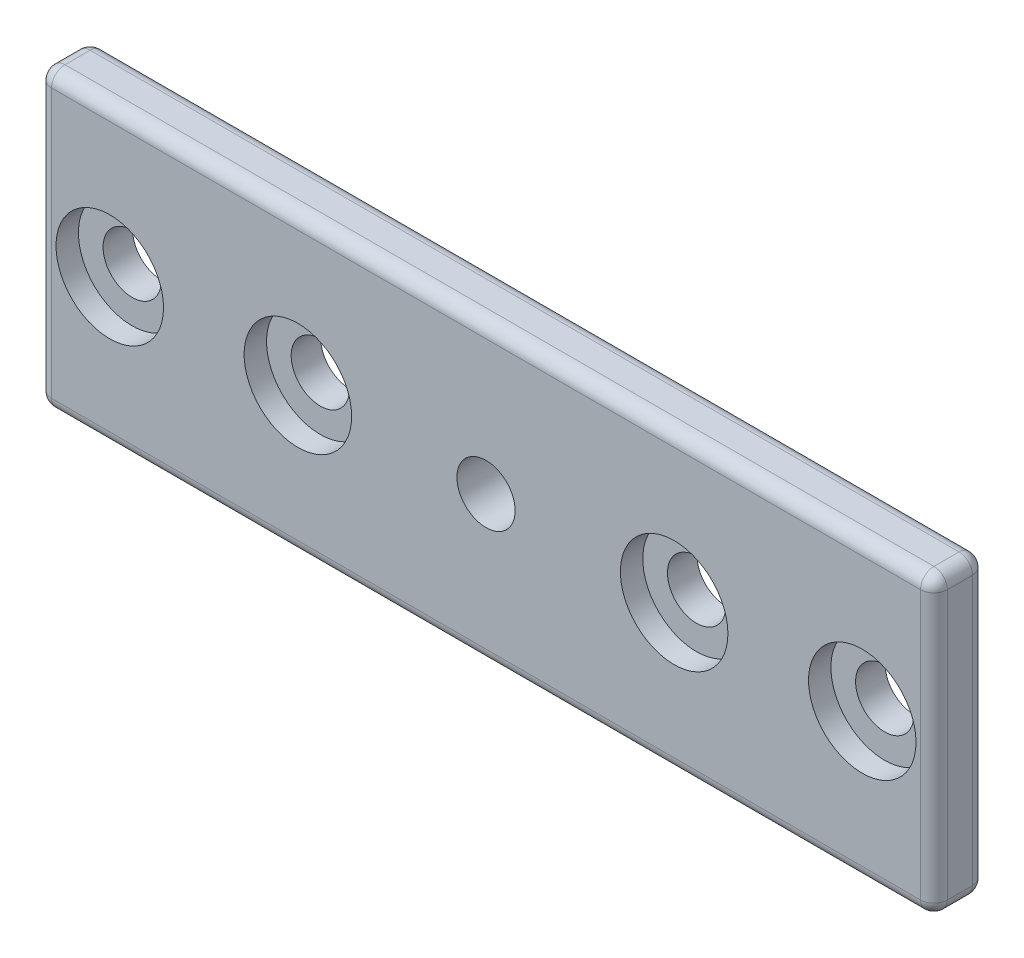
ISO-10303-21;
HEADER;
FILE_DESCRIPTION(('STEP AP214'),'2;1');
FILE_NAME('part.step','',(''),(''),'','','');
FILE_SCHEMA(('AUTOMOTIVE_DESIGN { 1 0 10303 214 1 1 1 1 }'));
ENDSEC;
DATA;
#1=APPLICATION_CONTEXT('core data for automotive mechanical design processes');
#2=APPLICATION_PROTOCOL_DEFINITION('international standard','automotive_design',2000,#1);
#3=PRODUCT_CONTEXT('',#1,'mechanical');
#4=PRODUCT('Part','Part','',(#3));
#5=PRODUCT_RELATED_PRODUCT_CATEGORY('part','',(#4));
#6=PRODUCT_DEFINITION_FORMATION('','',#4);
#7=PRODUCT_DEFINITION_CONTEXT('part definition',#1,'design');
#8=PRODUCT_DEFINITION('design','',#6,#7);
#9=PRODUCT_DEFINITION_SHAPE('','',#8);
#10=(LENGTH_UNIT() NAMED_UNIT(*) SI_UNIT(.MILLI.,.METRE.));
#11=(NAMED_UNIT(*) PLANE_ANGLE_UNIT() SI_UNIT($,.RADIAN.));
#12=(NAMED_UNIT(*) SI_UNIT($,.STERADIAN.) SOLID_ANGLE_UNIT());
#13=UNCERTAINTY_MEASURE_WITH_UNIT(LENGTH_MEASURE(1.E-05),#10,'distance_accuracy_value','');
#14=(GEOMETRIC_REPRESENTATION_CONTEXT(3) GLOBAL_UNCERTAINTY_ASSIGNED_CONTEXT((#13)) GLOBAL_UNIT_ASSIGNED_CONTEXT((#10,
#11,#12)) REPRESENTATION_CONTEXT('',''));
#15=CARTESIAN_POINT('',(0.,0.,0.));
#16=DIRECTION('',(0.,0.,1.));
#17=DIRECTION('',(1.,0.,0.));
#18=AXIS2_PLACEMENT_3D('',#15,#16,#17);
#19=CARTESIAN_POINT('',(92.,16.5,0.));
#20=DIRECTION('',(0.,0.,1.));
#21=DIRECTION('',(1.,0.,0.));
#22=AXIS2_PLACEMENT_3D('',#19,#20,#21);
#23=CYLINDRICAL_SURFACE('',#22,3.25000000000001);
#24=CARTESIAN_POINT('',(92.,16.5,0.));
#25=DIRECTION('',(0.,0.,1.));
#26=DIRECTION('',(1.,0.,0.));
#27=AXIS2_PLACEMENT_3D('',#24,#25,#26);
#28=CIRCLE('',#27,3.25000000000001);
#29=CARTESIAN_POINT('',(95.25,16.5,0.));
#30=VERTEX_POINT('',#29);
#31=EDGE_CURVE('E354',#30,#30,#28,.T.);
#32=ORIENTED_EDGE('',*,*,#31,.F.);
#33=EDGE_LOOP('',(#32));
#34=FACE_BOUND('',#33,.T.);
#35=CARTESIAN_POINT('',(92.,16.5,3.3));
#36=DIRECTION('',(0.,0.,1.));
#37=DIRECTION('',(1.,0.,0.));
#38=AXIS2_PLACEMENT_3D('',#35,#36,#37);
#39=CIRCLE('',#38,3.25000000000001);
#40=CARTESIAN_POINT('',(95.25,16.5,3.3));
#41=VERTEX_POINT('',#40);
#42=EDGE_CURVE('E183',#41,#41,#39,.F.);
#43=ORIENTED_EDGE('',*,*,#42,.F.);
#44=EDGE_LOOP('',(#43));
#45=FACE_BOUND('',#44,.T.);
#46=ADVANCED_FACE('F45',(#34,#45),#23,.F.);
#47=CARTESIAN_POINT('',(71.,16.5,0.));
#48=DIRECTION('',(0.,0.,1.));
#49=DIRECTION('',(1.,0.,0.));
#50=AXIS2_PLACEMENT_3D('',#47,#48,#49);
#51=CYLINDRICAL_SURFACE('',#50,3.24999999999999);
#52=CARTESIAN_POINT('',(71.,16.5,0.));
#53=DIRECTION('',(0.,0.,1.));
#54=DIRECTION('',(1.,0.,0.));
#55=AXIS2_PLACEMENT_3D('',#52,#53,#54);
#56=CIRCLE('',#55,3.24999999999999);
#57=CARTESIAN_POINT('',(74.25,16.5,0.));
#58=VERTEX_POINT('',#57);
#59=EDGE_CURVE('E350',#58,#58,#56,.T.);
#60=ORIENTED_EDGE('',*,*,#59,.F.);
#61=EDGE_LOOP('',(#60));
#62=FACE_BOUND('',#61,.T.);
#63=CARTESIAN_POINT('',(71.,16.5,3.3));
#64=DIRECTION('',(0.,0.,1.));
#65=DIRECTION('',(1.,0.,0.));
#66=AXIS2_PLACEMENT_3D('',#63,#64,#65);
#67=CIRCLE('',#66,3.24999999999999);
#68=CARTESIAN_POINT('',(74.25,16.5,3.3));
#69=VERTEX_POINT('',#68);
#70=EDGE_CURVE('E366',#69,#69,#67,.F.);
#71=ORIENTED_EDGE('',*,*,#70,.F.);
#72=EDGE_LOOP('',(#71));
#73=FACE_BOUND('',#72,.T.);
#74=ADVANCED_FACE('F378',(#62,#73),#51,.F.);
#75=CARTESIAN_POINT('',(29.,16.5,0.));
#76=DIRECTION('',(0.,0.,1.));
#77=DIRECTION('',(1.,0.,0.));
#78=AXIS2_PLACEMENT_3D('',#75,#76,#77);
#79=CYLINDRICAL_SURFACE('',#78,3.25);
#80=CARTESIAN_POINT('',(29.,16.5,0.));
#81=DIRECTION('',(0.,0.,1.));
#82=DIRECTION('',(1.,0.,0.));
#83=AXIS2_PLACEMENT_3D('',#80,#81,#82);
#84=CIRCLE('',#83,3.25);
#85=CARTESIAN_POINT('',(32.25,16.5,0.));
#86=VERTEX_POINT('',#85);
#87=EDGE_CURVE('E180',#86,#86,#84,.T.);
#88=ORIENTED_EDGE('',*,*,#87,.F.);
#89=EDGE_LOOP('',(#88));
#90=FACE_BOUND('',#89,.T.);
#91=CARTESIAN_POINT('',(29.,16.5,3.3));
#92=DIRECTION('',(0.,0.,1.));
#93=DIRECTION('',(1.,0.,0.));
#94=AXIS2_PLACEMENT_3D('',#91,#92,#93);
#95=CIRCLE('',#94,3.25);
#96=CARTESIAN_POINT('',(32.25,16.5,3.3));
#97=VERTEX_POINT('',#96);
#98=EDGE_CURVE('E362',#97,#97,#95,.F.);
#99=ORIENTED_EDGE('',*,*,#98,.F.);
#100=EDGE_LOOP('',(#99));
#101=FACE_BOUND('',#100,.T.);
#102=ADVANCED_FACE('F385',(#90,#101),#79,.F.);
#103=CARTESIAN_POINT('',(8.,16.5,0.));
#104=DIRECTION('',(0.,0.,1.));
#105=DIRECTION('',(1.,0.,0.));
#106=AXIS2_PLACEMENT_3D('',#103,#104,#105);
#107=CYLINDRICAL_SURFACE('',#106,3.25);
#108=CARTESIAN_POINT('',(8.,16.5,0.));
#109=DIRECTION('',(0.,0.,1.));
#110=DIRECTION('',(1.,0.,0.));
#111=AXIS2_PLACEMENT_3D('',#108,#109,#110);
#112=CIRCLE('',#111,3.25);
#113=CARTESIAN_POINT('',(11.25,16.5,0.));
#114=VERTEX_POINT('',#113);
#115=EDGE_CURVE('E176',#114,#114,#112,.T.);
#116=ORIENTED_EDGE('',*,*,#115,.F.);
#117=EDGE_LOOP('',(#116));
#118=FACE_BOUND('',#117,.T.);
#119=CARTESIAN_POINT('',(8.,16.5,3.3));
#120=DIRECTION('',(0.,0.,1.));
#121=DIRECTION('',(1.,0.,0.));
#122=AXIS2_PLACEMENT_3D('',#119,#120,#121);
#123=CIRCLE('',#122,3.25);
#124=CARTESIAN_POINT('',(11.25,16.5,3.3));
#125=VERTEX_POINT('',#124);
#126=EDGE_CURVE('E358',#125,#125,#123,.F.);
#127=ORIENTED_EDGE('',*,*,#126,.F.);
#128=EDGE_LOOP('',(#127));
#129=FACE_BOUND('',#128,.T.);
#130=ADVANCED_FACE('F412',(#118,#129),#107,.F.);
#131=CARTESIAN_POINT('',(0.,0.,5.8));
#132=DIRECTION('',(1.,0.,0.));
#133=DIRECTION('',(0.,0.,-1.));
#134=AXIS2_PLACEMENT_3D('',#131,#132,#133);
#135=PLANE('',#134);
#136=DIRECTION('',(0.,-1.,0.));
#137=VECTOR('',#136,1.);
#138=CARTESIAN_POINT('',(0.,0.,4.3));
#139=LINE('',#138,#137);
#140=CARTESIAN_POINT('',(0.,1.5,4.3));
#141=VERTEX_POINT('',#140);
#142=CARTESIAN_POINT('',(0.,31.5,4.3));
#143=VERTEX_POINT('',#142);
#144=EDGE_CURVE('E155',#141,#143,#139,.F.);
#145=ORIENTED_EDGE('',*,*,#144,.T.);
#146=DIRECTION('',(0.,0.,-1.));
#147=VECTOR('',#146,1.);
#148=CARTESIAN_POINT('',(0.,31.5,5.8));
#149=LINE('',#148,#147);
#150=CARTESIAN_POINT('',(0.,31.5,1.5));
#151=VERTEX_POINT('',#150);
#152=EDGE_CURVE('E224',#143,#151,#149,.T.);
#153=ORIENTED_EDGE('',*,*,#152,.T.);
#154=DIRECTION('',(0.,-1.,0.));
#155=VECTOR('',#154,1.);
#156=CARTESIAN_POINT('',(0.,0.,1.5));
#157=LINE('',#156,#155);
#158=CARTESIAN_POINT('',(0.,1.5,1.5));
#159=VERTEX_POINT('',#158);
#160=EDGE_CURVE('E219',#151,#159,#157,.T.);
#161=ORIENTED_EDGE('',*,*,#160,.T.);
#162=DIRECTION('',(0.,0.,-1.));
#163=VECTOR('',#162,1.);
#164=CARTESIAN_POINT('',(0.,1.5,5.8));
#165=LINE('',#164,#163);
#166=EDGE_CURVE('E216',#159,#141,#165,.F.);
#167=ORIENTED_EDGE('',*,*,#166,.T.);
#168=EDGE_LOOP('',(#145,#153,#161,#167));
#169=FACE_BOUND('',#168,.T.);
#170=ADVANCED_FACE('F409',(#169),#135,.F.);
#171=CARTESIAN_POINT('',(0.,0.,5.8));
#172=DIRECTION('',(0.,1.,0.));
#173=DIRECTION('',(0.,0.,1.));
#174=AXIS2_PLACEMENT_3D('',#171,#172,#173);
#175=PLANE('',#174);
#176=DIRECTION('',(1.,0.,0.));
#177=VECTOR('',#176,1.);
#178=CARTESIAN_POINT('',(0.,0.,4.3));
#179=LINE('',#178,#177);
#180=CARTESIAN_POINT('',(98.5,0.,4.3));
#181=VERTEX_POINT('',#180);
#182=CARTESIAN_POINT('',(1.5,0.,4.3));
#183=VERTEX_POINT('',#182);
#184=EDGE_CURVE('E55',#181,#183,#179,.F.);
#185=ORIENTED_EDGE('',*,*,#184,.T.);
#186=DIRECTION('',(0.,0.,-1.));
#187=VECTOR('',#186,1.);
#188=CARTESIAN_POINT('',(1.5,0.,5.8));
#189=LINE('',#188,#187);
#190=CARTESIAN_POINT('',(1.5,0.,1.5));
#191=VERTEX_POINT('',#190);
#192=EDGE_CURVE('E11',#183,#191,#189,.T.);
#193=ORIENTED_EDGE('',*,*,#192,.T.);
#194=DIRECTION('',(1.,0.,0.));
#195=VECTOR('',#194,1.);
#196=CARTESIAN_POINT('',(100.,0.,1.5));
#197=LINE('',#196,#195);
#198=CARTESIAN_POINT('',(98.5,0.,1.5));
#199=VERTEX_POINT('',#198);
#200=EDGE_CURVE('E240',#191,#199,#197,.T.);
#201=ORIENTED_EDGE('',*,*,#200,.T.);
#202=DIRECTION('',(0.,0.,-1.));
#203=VECTOR('',#202,1.);
#204=CARTESIAN_POINT('',(98.5,0.,5.8));
#205=LINE('',#204,#203);
#206=EDGE_CURVE('E66',#199,#181,#205,.F.);
#207=ORIENTED_EDGE('',*,*,#206,.T.);
#208=EDGE_LOOP('',(#185,#193,#201,#207));
#209=FACE_BOUND('',#208,.T.);
#210=ADVANCED_FACE('F405',(#209),#175,.F.);
#211=CARTESIAN_POINT('',(100.,0.,5.8));
#212=DIRECTION('',(-1.,0.,0.));
#213=DIRECTION('',(0.,0.,1.));
#214=AXIS2_PLACEMENT_3D('',#211,#212,#213);
#215=PLANE('',#214);
#216=DIRECTION('',(0.,1.,0.));
#217=VECTOR('',#216,1.);
#218=CARTESIAN_POINT('',(100.,33.,1.5));
#219=LINE('',#218,#217);
#220=CARTESIAN_POINT('',(100.,1.5,1.5));
#221=VERTEX_POINT('',#220);
#222=CARTESIAN_POINT('',(100.,31.5,1.5));
#223=VERTEX_POINT('',#222);
#224=EDGE_CURVE('E193',#221,#223,#219,.T.);
#225=ORIENTED_EDGE('',*,*,#224,.T.);
#226=DIRECTION('',(0.,0.,-1.));
#227=VECTOR('',#226,1.);
#228=CARTESIAN_POINT('',(100.,31.5,5.8));
#229=LINE('',#228,#227);
#230=CARTESIAN_POINT('',(100.,31.5,4.3));
#231=VERTEX_POINT('',#230);
#232=EDGE_CURVE('E200',#223,#231,#229,.F.);
#233=ORIENTED_EDGE('',*,*,#232,.T.);
#234=DIRECTION('',(0.,1.,0.));
#235=VECTOR('',#234,1.);
#236=CARTESIAN_POINT('',(100.,0.,4.3));
#237=LINE('',#236,#235);
#238=CARTESIAN_POINT('',(100.,1.5,4.3));
#239=VERTEX_POINT('',#238);
#240=EDGE_CURVE('E196',#231,#239,#237,.F.);
#241=ORIENTED_EDGE('',*,*,#240,.T.);
#242=DIRECTION('',(0.,0.,-1.));
#243=VECTOR('',#242,1.);
#244=CARTESIAN_POINT('',(100.,1.5,5.8));
#245=LINE('',#244,#243);
#246=EDGE_CURVE('E190',#239,#221,#245,.T.);
#247=ORIENTED_EDGE('',*,*,#246,.T.);
#248=EDGE_LOOP('',(#225,#233,#241,#247));
#249=FACE_BOUND('',#248,.T.);
#250=ADVANCED_FACE('F401',(#249),#215,.F.);
#251=CARTESIAN_POINT('',(0.,33.,5.8));
#252=DIRECTION('',(0.,-1.,0.));
#253=DIRECTION('',(0.,0.,-1.));
#254=AXIS2_PLACEMENT_3D('',#251,#252,#253);
#255=PLANE('',#254);
#256=DIRECTION('',(-1.,0.,0.));
#257=VECTOR('',#256,1.);
#258=CARTESIAN_POINT('',(0.,33.,4.3));
#259=LINE('',#258,#257);
#260=CARTESIAN_POINT('',(1.5,33.,4.3));
#261=VERTEX_POINT('',#260);
#262=CARTESIAN_POINT('',(98.5,33.,4.3));
#263=VERTEX_POINT('',#262);
#264=EDGE_CURVE('E233',#261,#263,#259,.F.);
#265=ORIENTED_EDGE('',*,*,#264,.T.);
#266=DIRECTION('',(0.,0.,-1.));
#267=VECTOR('',#266,1.);
#268=CARTESIAN_POINT('',(98.5,33.,5.8));
#269=LINE('',#268,#267);
#270=CARTESIAN_POINT('',(98.5,33.,1.5));
#271=VERTEX_POINT('',#270);
#272=EDGE_CURVE('E236',#263,#271,#269,.T.);
#273=ORIENTED_EDGE('',*,*,#272,.T.);
#274=DIRECTION('',(-1.,0.,0.));
#275=VECTOR('',#274,1.);
#276=CARTESIAN_POINT('',(0.,33.,1.5));
#277=LINE('',#276,#275);
#278=CARTESIAN_POINT('',(1.5,33.,1.5));
#279=VERTEX_POINT('',#278);
#280=EDGE_CURVE('E227',#271,#279,#277,.T.);
#281=ORIENTED_EDGE('',*,*,#280,.T.);
#282=DIRECTION('',(0.,0.,-1.));
#283=VECTOR('',#282,1.);
#284=CARTESIAN_POINT('',(1.5,33.,5.8));
#285=LINE('',#284,#283);
#286=EDGE_CURVE('E230',#279,#261,#285,.F.);
#287=ORIENTED_EDGE('',*,*,#286,.T.);
#288=EDGE_LOOP('',(#265,#273,#281,#287));
#289=FACE_BOUND('',#288,.T.);
#290=ADVANCED_FACE('F394',(#289),#255,.F.);
#291=CARTESIAN_POINT('',(0.,0.,5.8));
#292=DIRECTION('',(0.,0.,-1.));
#293=DIRECTION('',(-1.,0.,0.));
#294=AXIS2_PLACEMENT_3D('',#291,#292,#293);
#295=PLANE('',#294);
#296=DIRECTION('',(0.,1.,0.));
#297=VECTOR('',#296,1.);
#298=CARTESIAN_POINT('',(98.5,0.,5.8));
#299=LINE('',#298,#297);
#300=CARTESIAN_POINT('',(98.5,1.5,5.8));
#301=VERTEX_POINT('',#300);
#302=CARTESIAN_POINT('',(98.5,31.5,5.8));
#303=VERTEX_POINT('',#302);
#304=EDGE_CURVE('E147',#301,#303,#299,.T.);
#305=ORIENTED_EDGE('',*,*,#304,.T.);
#306=DIRECTION('',(-1.,0.,0.));
#307=VECTOR('',#306,1.);
#308=CARTESIAN_POINT('',(0.,31.5,5.8));
#309=LINE('',#308,#307);
#310=CARTESIAN_POINT('',(1.5,31.5,5.8));
#311=VERTEX_POINT('',#310);
#312=EDGE_CURVE('E142',#303,#311,#309,.T.);
#313=ORIENTED_EDGE('',*,*,#312,.T.);
#314=DIRECTION('',(0.,-1.,0.));
#315=VECTOR('',#314,1.);
#316=CARTESIAN_POINT('',(1.5,0.,5.8));
#317=LINE('',#316,#315);
#318=CARTESIAN_POINT('',(1.5,1.5,5.8));
#319=VERTEX_POINT('',#318);
#320=EDGE_CURVE('E133',#311,#319,#317,.T.);
#321=ORIENTED_EDGE('',*,*,#320,.T.);
#322=DIRECTION('',(1.,0.,0.));
#323=VECTOR('',#322,1.);
#324=CARTESIAN_POINT('',(0.,1.5,5.8));
#325=LINE('',#324,#323);
#326=EDGE_CURVE('E139',#319,#301,#325,.T.);
#327=ORIENTED_EDGE('',*,*,#326,.T.);
#328=EDGE_LOOP('',(#305,#313,#321,#327));
#329=FACE_BOUND('',#328,.T.);
#330=CARTESIAN_POINT('',(8.,16.5,5.8));
#331=DIRECTION('',(0.,0.,1.));
#332=DIRECTION('',(1.,0.,0.));
#333=AXIS2_PLACEMENT_3D('',#330,#331,#332);
#334=CIRCLE('',#333,6.);
#335=CARTESIAN_POINT('',(14.,16.5,5.8));
#336=VERTEX_POINT('',#335);
#337=EDGE_CURVE('E571',#336,#336,#334,.T.);
#338=ORIENTED_EDGE('',*,*,#337,.F.);
#339=EDGE_LOOP('',(#338));
#340=FACE_BOUND('',#339,.T.);
#341=CARTESIAN_POINT('',(29.,16.5,5.8));
#342=DIRECTION('',(0.,0.,1.));
#343=DIRECTION('',(1.,0.,0.));
#344=AXIS2_PLACEMENT_3D('',#341,#342,#343);
#345=CIRCLE('',#344,6.);
#346=CARTESIAN_POINT('',(35.,16.5,5.8));
#347=VERTEX_POINT('',#346);
#348=EDGE_CURVE('E573',#347,#347,#345,.T.);
#349=ORIENTED_EDGE('',*,*,#348,.F.);
#350=EDGE_LOOP('',(#349));
#351=FACE_BOUND('',#350,.T.);
#352=CARTESIAN_POINT('',(71.,16.5,5.8));
#353=DIRECTION('',(0.,0.,1.));
#354=DIRECTION('',(1.,0.,0.));
#355=AXIS2_PLACEMENT_3D('',#352,#353,#354);
#356=CIRCLE('',#355,6.);
#357=CARTESIAN_POINT('',(77.,16.5,5.8));
#358=VERTEX_POINT('',#357);
#359=EDGE_CURVE('E585',#358,#358,#356,.T.);
#360=ORIENTED_EDGE('',*,*,#359,.F.);
#361=EDGE_LOOP('',(#360));
#362=FACE_BOUND('',#361,.T.);
#363=CARTESIAN_POINT('',(92.,16.5,5.8));
#364=DIRECTION('',(0.,0.,1.));
#365=DIRECTION('',(1.,0.,0.));
#366=AXIS2_PLACEMENT_3D('',#363,#364,#365);
#367=CIRCLE('',#366,6.);
#368=CARTESIAN_POINT('',(98.,16.5,5.8));
#369=VERTEX_POINT('',#368);
#370=EDGE_CURVE('E329',#369,#369,#367,.T.);
#371=ORIENTED_EDGE('',*,*,#370,.F.);
#372=EDGE_LOOP('',(#371));
#373=FACE_BOUND('',#372,.T.);
#374=CARTESIAN_POINT('',(50.,16.5,5.8));
#375=DIRECTION('',(0.,0.,1.));
#376=DIRECTION('',(1.,0.,0.));
#377=AXIS2_PLACEMENT_3D('',#374,#375,#376);
#378=CIRCLE('',#377,3.25);
#379=CARTESIAN_POINT('',(53.25,16.5,5.8));
#380=VERTEX_POINT('',#379);
#381=EDGE_CURVE('E342',#380,#380,#378,.T.);
#382=ORIENTED_EDGE('',*,*,#381,.F.);
#383=EDGE_LOOP('',(#382));
#384=FACE_BOUND('',#383,.T.);
#385=ADVANCED_FACE('F136',(#329,#340,#351,#362,#373,#384),#295,.F.);
#386=CARTESIAN_POINT('',(0.,0.,0.));
#387=DIRECTION('',(0.,0.,-1.));
#388=DIRECTION('',(-1.,0.,0.));
#389=AXIS2_PLACEMENT_3D('',#386,#387,#388);
#390=PLANE('',#389);
#391=DIRECTION('',(0.,-1.,0.));
#392=VECTOR('',#391,1.);
#393=CARTESIAN_POINT('',(1.5,33.,0.));
#394=LINE('',#393,#392);
#395=CARTESIAN_POINT('',(1.5,1.5,0.));
#396=VERTEX_POINT('',#395);
#397=CARTESIAN_POINT('',(1.5,31.5,0.));
#398=VERTEX_POINT('',#397);
#399=EDGE_CURVE('E206',#396,#398,#394,.F.);
#400=ORIENTED_EDGE('',*,*,#399,.T.);
#401=DIRECTION('',(-1.,0.,0.));
#402=VECTOR('',#401,1.);
#403=CARTESIAN_POINT('',(100.,31.5,0.));
#404=LINE('',#403,#402);
#405=CARTESIAN_POINT('',(98.5,31.5,0.));
#406=VERTEX_POINT('',#405);
#407=EDGE_CURVE('E213',#398,#406,#404,.F.);
#408=ORIENTED_EDGE('',*,*,#407,.T.);
#409=DIRECTION('',(0.,1.,0.));
#410=VECTOR('',#409,1.);
#411=CARTESIAN_POINT('',(98.5,0.,0.));
#412=LINE('',#411,#410);
#413=CARTESIAN_POINT('',(98.5,1.5,0.));
#414=VERTEX_POINT('',#413);
#415=EDGE_CURVE('E209',#406,#414,#412,.F.);
#416=ORIENTED_EDGE('',*,*,#415,.T.);
#417=DIRECTION('',(1.,0.,0.));
#418=VECTOR('',#417,1.);
#419=CARTESIAN_POINT('',(0.,1.5,0.));
#420=LINE('',#419,#418);
#421=EDGE_CURVE('E203',#414,#396,#420,.F.);
#422=ORIENTED_EDGE('',*,*,#421,.T.);
#423=EDGE_LOOP('',(#400,#408,#416,#422));
#424=FACE_BOUND('',#423,.T.);
#425=ORIENTED_EDGE('',*,*,#115,.T.);
#426=EDGE_LOOP('',(#425));
#427=FACE_BOUND('',#426,.T.);
#428=ORIENTED_EDGE('',*,*,#87,.T.);
#429=EDGE_LOOP('',(#428));
#430=FACE_BOUND('',#429,.T.);
#431=CARTESIAN_POINT('',(50.,16.5,0.));
#432=DIRECTION('',(0.,0.,1.));
#433=DIRECTION('',(1.,0.,0.));
#434=AXIS2_PLACEMENT_3D('',#431,#432,#433);
#435=CIRCLE('',#434,3.25);
#436=CARTESIAN_POINT('',(53.25,16.5,0.));
#437=VERTEX_POINT('',#436);
#438=EDGE_CURVE('E346',#437,#437,#435,.T.);
#439=ORIENTED_EDGE('',*,*,#438,.T.);
#440=EDGE_LOOP('',(#439));
#441=FACE_BOUND('',#440,.T.);
#442=ORIENTED_EDGE('',*,*,#59,.T.);
#443=EDGE_LOOP('',(#442));
#444=FACE_BOUND('',#443,.T.);
#445=ORIENTED_EDGE('',*,*,#31,.T.);
#446=EDGE_LOOP('',(#445));
#447=FACE_BOUND('',#446,.T.);
#448=ADVANCED_FACE('F393',(#424,#427,#430,#441,#444,#447),#390,.T.);
#449=CARTESIAN_POINT('',(50.,16.5,0.));
#450=DIRECTION('',(0.,0.,1.));
#451=DIRECTION('',(1.,0.,0.));
#452=AXIS2_PLACEMENT_3D('',#449,#450,#451);
#453=CYLINDRICAL_SURFACE('',#452,3.25);
#454=ORIENTED_EDGE('',*,*,#438,.F.);
#455=EDGE_LOOP('',(#454));
#456=FACE_BOUND('',#455,.T.);
#457=ORIENTED_EDGE('',*,*,#381,.T.);
#458=EDGE_LOOP('',(#457));
#459=FACE_BOUND('',#458,.T.);
#460=ADVANCED_FACE('F397',(#456,#459),#453,.F.);
#461=CARTESIAN_POINT('',(8.,16.5,3.3));
#462=DIRECTION('',(0.,0.,1.));
#463=DIRECTION('',(1.,0.,0.));
#464=AXIS2_PLACEMENT_3D('',#461,#462,#463);
#465=PLANE('',#464);
#466=CARTESIAN_POINT('',(8.,16.5,3.3));
#467=DIRECTION('',(0.,0.,1.));
#468=DIRECTION('',(1.,0.,0.));
#469=AXIS2_PLACEMENT_3D('',#466,#467,#468);
#470=CIRCLE('',#469,6.);
#471=CARTESIAN_POINT('',(14.,16.5,3.3));
#472=VERTEX_POINT('',#471);
#473=EDGE_CURVE('E363',#472,#472,#470,.T.);
#474=ORIENTED_EDGE('',*,*,#473,.T.);
#475=EDGE_LOOP('',(#474));
#476=FACE_BOUND('',#475,.T.);
#477=ORIENTED_EDGE('',*,*,#126,.T.);
#478=EDGE_LOOP('',(#477));
#479=FACE_BOUND('',#478,.T.);
#480=ADVANCED_FACE('F525',(#476,#479),#465,.T.);
#481=CARTESIAN_POINT('',(8.,16.5,3.3));
#482=DIRECTION('',(0.,0.,1.));
#483=DIRECTION('',(1.,0.,0.));
#484=AXIS2_PLACEMENT_3D('',#481,#482,#483);
#485=CYLINDRICAL_SURFACE('',#484,6.);
#486=ORIENTED_EDGE('',*,*,#473,.F.);
#487=EDGE_LOOP('',(#486));
#488=FACE_BOUND('',#487,.T.);
#489=ORIENTED_EDGE('',*,*,#337,.T.);
#490=EDGE_LOOP('',(#489));
#491=FACE_BOUND('',#490,.T.);
#492=ADVANCED_FACE('F531',(#488,#491),#485,.F.);
#493=CARTESIAN_POINT('',(29.,16.5,3.3));
#494=DIRECTION('',(0.,0.,1.));
#495=DIRECTION('',(1.,0.,0.));
#496=AXIS2_PLACEMENT_3D('',#493,#494,#495);
#497=PLANE('',#496);
#498=CARTESIAN_POINT('',(29.,16.5,3.3));
#499=DIRECTION('',(0.,0.,1.));
#500=DIRECTION('',(1.,0.,0.));
#501=AXIS2_PLACEMENT_3D('',#498,#499,#500);
#502=CIRCLE('',#501,6.);
#503=CARTESIAN_POINT('',(35.,16.5,3.3));
#504=VERTEX_POINT('',#503);
#505=EDGE_CURVE('E579',#504,#504,#502,.T.);
#506=ORIENTED_EDGE('',*,*,#505,.T.);
#507=EDGE_LOOP('',(#506));
#508=FACE_BOUND('',#507,.T.);
#509=ORIENTED_EDGE('',*,*,#98,.T.);
#510=EDGE_LOOP('',(#509));
#511=FACE_BOUND('',#510,.T.);
#512=ADVANCED_FACE('F555',(#508,#511),#497,.T.);
#513=CARTESIAN_POINT('',(29.,16.5,3.3));
#514=DIRECTION('',(0.,0.,1.));
#515=DIRECTION('',(1.,0.,0.));
#516=AXIS2_PLACEMENT_3D('',#513,#514,#515);
#517=CYLINDRICAL_SURFACE('',#516,6.);
#518=ORIENTED_EDGE('',*,*,#505,.F.);
#519=EDGE_LOOP('',(#518));
#520=FACE_BOUND('',#519,.T.);
#521=ORIENTED_EDGE('',*,*,#348,.T.);
#522=EDGE_LOOP('',(#521));
#523=FACE_BOUND('',#522,.T.);
#524=ADVANCED_FACE('F550',(#520,#523),#517,.F.);
#525=CARTESIAN_POINT('',(71.,16.5,3.3));
#526=DIRECTION('',(0.,0.,1.));
#527=DIRECTION('',(1.,0.,0.));
#528=AXIS2_PLACEMENT_3D('',#525,#526,#527);
#529=PLANE('',#528);
#530=CARTESIAN_POINT('',(71.,16.5,3.3));
#531=DIRECTION('',(0.,0.,1.));
#532=DIRECTION('',(1.,0.,0.));
#533=AXIS2_PLACEMENT_3D('',#530,#531,#532);
#534=CIRCLE('',#533,6.);
#535=CARTESIAN_POINT('',(77.,16.5,3.3));
#536=VERTEX_POINT('',#535);
#537=EDGE_CURVE('E335',#536,#536,#534,.T.);
#538=ORIENTED_EDGE('',*,*,#537,.T.);
#539=EDGE_LOOP('',(#538));
#540=FACE_BOUND('',#539,.T.);
#541=ORIENTED_EDGE('',*,*,#70,.T.);
#542=EDGE_LOOP('',(#541));
#543=FACE_BOUND('',#542,.T.);
#544=ADVANCED_FACE('F547',(#540,#543),#529,.T.);
#545=CARTESIAN_POINT('',(71.,16.5,3.3));
#546=DIRECTION('',(0.,0.,1.));
#547=DIRECTION('',(1.,0.,0.));
#548=AXIS2_PLACEMENT_3D('',#545,#546,#547);
#549=CYLINDRICAL_SURFACE('',#548,6.);
#550=ORIENTED_EDGE('',*,*,#537,.F.);
#551=EDGE_LOOP('',(#550));
#552=FACE_BOUND('',#551,.T.);
#553=ORIENTED_EDGE('',*,*,#359,.T.);
#554=EDGE_LOOP('',(#553));
#555=FACE_BOUND('',#554,.T.);
#556=ADVANCED_FACE('F543',(#552,#555),#549,.F.);
#557=CARTESIAN_POINT('',(92.,16.5,3.3));
#558=DIRECTION('',(0.,0.,1.));
#559=DIRECTION('',(1.,0.,0.));
#560=AXIS2_PLACEMENT_3D('',#557,#558,#559);
#561=PLANE('',#560);
#562=CARTESIAN_POINT('',(92.,16.5,3.3));
#563=DIRECTION('',(0.,0.,1.));
#564=DIRECTION('',(1.,0.,0.));
#565=AXIS2_PLACEMENT_3D('',#562,#563,#564);
#566=CIRCLE('',#565,6.);
#567=CARTESIAN_POINT('',(98.,16.5,3.3));
#568=VERTEX_POINT('',#567);
#569=EDGE_CURVE('E322',#568,#568,#566,.T.);
#570=ORIENTED_EDGE('',*,*,#569,.T.);
#571=EDGE_LOOP('',(#570));
#572=FACE_BOUND('',#571,.T.);
#573=ORIENTED_EDGE('',*,*,#42,.T.);
#574=EDGE_LOOP('',(#573));
#575=FACE_BOUND('',#574,.T.);
#576=ADVANCED_FACE('F375',(#572,#575),#561,.T.);
#577=CARTESIAN_POINT('',(92.,16.5,3.3));
#578=DIRECTION('',(0.,0.,1.));
#579=DIRECTION('',(1.,0.,0.));
#580=AXIS2_PLACEMENT_3D('',#577,#578,#579);
#581=CYLINDRICAL_SURFACE('',#580,6.);
#582=ORIENTED_EDGE('',*,*,#569,.F.);
#583=EDGE_LOOP('',(#582));
#584=FACE_BOUND('',#583,.T.);
#585=ORIENTED_EDGE('',*,*,#370,.T.);
#586=EDGE_LOOP('',(#585));
#587=FACE_BOUND('',#586,.T.);
#588=ADVANCED_FACE('F483',(#584,#587),#581,.F.);
#589=CARTESIAN_POINT('',(1.5,0.,1.5));
#590=DIRECTION('',(0.,1.,0.));
#591=DIRECTION('',(0.,0.,1.));
#592=AXIS2_PLACEMENT_3D('',#589,#590,#591);
#593=CYLINDRICAL_SURFACE('',#592,1.5);
#594=CARTESIAN_POINT('',(1.5,1.5,1.5));
#595=DIRECTION('',(0.,-1.,0.));
#596=DIRECTION('',(0.,0.,-1.));
#597=AXIS2_PLACEMENT_3D('',#594,#595,#596);
#598=CIRCLE('',#597,1.5);
#599=EDGE_CURVE('E49',#159,#396,#598,.T.);
#600=ORIENTED_EDGE('',*,*,#599,.F.);
#601=ORIENTED_EDGE('',*,*,#160,.F.);
#602=CARTESIAN_POINT('',(1.5,31.5,1.5));
#603=DIRECTION('',(0.,1.,0.));
#604=DIRECTION('',(0.,0.,1.));
#605=AXIS2_PLACEMENT_3D('',#602,#603,#604);
#606=CIRCLE('',#605,1.5);
#607=EDGE_CURVE('E313',#398,#151,#606,.T.);
#608=ORIENTED_EDGE('',*,*,#607,.F.);
#609=ORIENTED_EDGE('',*,*,#399,.F.);
#610=EDGE_LOOP('',(#600,#601,#608,#609));
#611=FACE_BOUND('',#610,.T.);
#612=ADVANCED_FACE('F47',(#611),#593,.T.);
#613=CARTESIAN_POINT('',(1.5,1.5,1.5));
#614=DIRECTION('',(0.,0.,-1.));
#615=DIRECTION('',(-1.,0.,0.));
#616=AXIS2_PLACEMENT_3D('',#613,#614,#615);
#617=SPHERICAL_SURFACE('',#616,1.5);
#618=CARTESIAN_POINT('',(1.5,1.5,1.5));
#619=DIRECTION('',(0.,0.,-1.));
#620=DIRECTION('',(-1.,0.,0.));
#621=AXIS2_PLACEMENT_3D('',#618,#619,#620);
#622=CIRCLE('',#621,1.5);
#623=EDGE_CURVE('E306',#159,#191,#622,.F.);
#624=ORIENTED_EDGE('',*,*,#623,.F.);
#625=ORIENTED_EDGE('',*,*,#599,.T.);
#626=CARTESIAN_POINT('',(1.5,1.5,1.5));
#627=DIRECTION('',(-1.,0.,0.));
#628=DIRECTION('',(0.,0.,1.));
#629=AXIS2_PLACEMENT_3D('',#626,#627,#628);
#630=CIRCLE('',#629,1.5);
#631=EDGE_CURVE('E310',#191,#396,#630,.F.);
#632=ORIENTED_EDGE('',*,*,#631,.F.);
#633=EDGE_LOOP('',(#624,#625,#632));
#634=FACE_BOUND('',#633,.T.);
#635=ADVANCED_FACE('F478',(#634),#617,.T.);
#636=CARTESIAN_POINT('',(1.5,31.5,1.5));
#637=DIRECTION('',(-1.,0.,0.));
#638=DIRECTION('',(0.,0.,1.));
#639=AXIS2_PLACEMENT_3D('',#636,#637,#638);
#640=SPHERICAL_SURFACE('',#639,1.5);
#641=CARTESIAN_POINT('',(1.5,31.5,1.5));
#642=DIRECTION('',(-1.,0.,0.));
#643=DIRECTION('',(0.,0.,1.));
#644=AXIS2_PLACEMENT_3D('',#641,#642,#643);
#645=CIRCLE('',#644,1.5);
#646=EDGE_CURVE('E298',#398,#279,#645,.F.);
#647=ORIENTED_EDGE('',*,*,#646,.F.);
#648=ORIENTED_EDGE('',*,*,#607,.T.);
#649=CARTESIAN_POINT('',(1.5,31.5,1.5));
#650=DIRECTION('',(0.,0.,-1.));
#651=DIRECTION('',(-1.,0.,0.));
#652=AXIS2_PLACEMENT_3D('',#649,#650,#651);
#653=CIRCLE('',#652,1.5);
#654=EDGE_CURVE('E302',#279,#151,#653,.F.);
#655=ORIENTED_EDGE('',*,*,#654,.F.);
#656=EDGE_LOOP('',(#647,#648,#655));
#657=FACE_BOUND('',#656,.T.);
#658=ADVANCED_FACE('F475',(#657),#640,.T.);
#659=CARTESIAN_POINT('',(0.,1.5,1.5));
#660=DIRECTION('',(-1.,0.,0.));
#661=DIRECTION('',(0.,0.,1.));
#662=AXIS2_PLACEMENT_3D('',#659,#660,#661);
#663=CYLINDRICAL_SURFACE('',#662,1.5);
#664=ORIENTED_EDGE('',*,*,#631,.T.);
#665=ORIENTED_EDGE('',*,*,#421,.F.);
#666=CARTESIAN_POINT('',(98.5,1.5,1.5));
#667=DIRECTION('',(1.,0.,0.));
#668=DIRECTION('',(0.,0.,-1.));
#669=AXIS2_PLACEMENT_3D('',#666,#667,#668);
#670=CIRCLE('',#669,1.5);
#671=EDGE_CURVE('E291',#199,#414,#670,.T.);
#672=ORIENTED_EDGE('',*,*,#671,.F.);
#673=ORIENTED_EDGE('',*,*,#200,.F.);
#674=EDGE_LOOP('',(#664,#665,#672,#673));
#675=FACE_BOUND('',#674,.T.);
#676=ADVANCED_FACE('F471',(#675),#663,.T.);
#677=CARTESIAN_POINT('',(1.5,1.5,5.8));
#678=DIRECTION('',(0.,0.,-1.));
#679=DIRECTION('',(-1.,0.,0.));
#680=AXIS2_PLACEMENT_3D('',#677,#678,#679);
#681=CYLINDRICAL_SURFACE('',#680,1.5);
#682=ORIENTED_EDGE('',*,*,#623,.T.);
#683=ORIENTED_EDGE('',*,*,#192,.F.);
#684=CARTESIAN_POINT('',(1.5,1.5,4.3));
#685=DIRECTION('',(0.,0.,1.));
#686=DIRECTION('',(1.,0.,0.));
#687=AXIS2_PLACEMENT_3D('',#684,#685,#686);
#688=CIRCLE('',#687,1.5);
#689=EDGE_CURVE('E160',#141,#183,#688,.T.);
#690=ORIENTED_EDGE('',*,*,#689,.F.);
#691=ORIENTED_EDGE('',*,*,#166,.F.);
#692=EDGE_LOOP('',(#682,#683,#690,#691));
#693=FACE_BOUND('',#692,.T.);
#694=ADVANCED_FACE('F468',(#693),#681,.T.);
#695=CARTESIAN_POINT('',(1.5,0.,4.3));
#696=DIRECTION('',(0.,-1.,0.));
#697=DIRECTION('',(0.,0.,-1.));
#698=AXIS2_PLACEMENT_3D('',#695,#696,#697);
#699=CYLINDRICAL_SURFACE('',#698,1.5);
#700=CARTESIAN_POINT('',(1.5,31.5,4.3));
#701=DIRECTION('',(0.,1.,0.));
#702=DIRECTION('',(0.,0.,1.));
#703=AXIS2_PLACEMENT_3D('',#700,#701,#702);
#704=CIRCLE('',#703,1.5);
#705=EDGE_CURVE('E161',#143,#311,#704,.T.);
#706=ORIENTED_EDGE('',*,*,#705,.F.);
#707=ORIENTED_EDGE('',*,*,#144,.F.);
#708=CARTESIAN_POINT('',(1.5,1.5,4.3));
#709=DIRECTION('',(0.,-1.,0.));
#710=DIRECTION('',(0.,0.,-1.));
#711=AXIS2_PLACEMENT_3D('',#708,#709,#710);
#712=CIRCLE('',#711,1.5);
#713=EDGE_CURVE('E151',#319,#141,#712,.T.);
#714=ORIENTED_EDGE('',*,*,#713,.F.);
#715=ORIENTED_EDGE('',*,*,#320,.F.);
#716=EDGE_LOOP('',(#706,#707,#714,#715));
#717=FACE_BOUND('',#716,.T.);
#718=ADVANCED_FACE('F153',(#717),#699,.T.);
#719=CARTESIAN_POINT('',(1.5,31.5,5.8));
#720=DIRECTION('',(0.,0.,-1.));
#721=DIRECTION('',(-1.,0.,0.));
#722=AXIS2_PLACEMENT_3D('',#719,#720,#721);
#723=CYLINDRICAL_SURFACE('',#722,1.5);
#724=ORIENTED_EDGE('',*,*,#654,.T.);
#725=ORIENTED_EDGE('',*,*,#152,.F.);
#726=CARTESIAN_POINT('',(1.5,31.5,4.3));
#727=DIRECTION('',(0.,0.,1.));
#728=DIRECTION('',(1.,0.,0.));
#729=AXIS2_PLACEMENT_3D('',#726,#727,#728);
#730=CIRCLE('',#729,1.5);
#731=EDGE_CURVE('E284',#261,#143,#730,.T.);
#732=ORIENTED_EDGE('',*,*,#731,.F.);
#733=ORIENTED_EDGE('',*,*,#286,.F.);
#734=EDGE_LOOP('',(#724,#725,#732,#733));
#735=FACE_BOUND('',#734,.T.);
#736=ADVANCED_FACE('F461',(#735),#723,.T.);
#737=CARTESIAN_POINT('',(0.,31.5,1.5));
#738=DIRECTION('',(1.,0.,0.));
#739=DIRECTION('',(0.,0.,-1.));
#740=AXIS2_PLACEMENT_3D('',#737,#738,#739);
#741=CYLINDRICAL_SURFACE('',#740,1.5);
#742=ORIENTED_EDGE('',*,*,#646,.T.);
#743=ORIENTED_EDGE('',*,*,#280,.F.);
#744=CARTESIAN_POINT('',(98.5,31.5,1.5));
#745=DIRECTION('',(1.,0.,0.));
#746=DIRECTION('',(0.,0.,-1.));
#747=AXIS2_PLACEMENT_3D('',#744,#745,#746);
#748=CIRCLE('',#747,1.5);
#749=EDGE_CURVE('E280',#406,#271,#748,.T.);
#750=ORIENTED_EDGE('',*,*,#749,.F.);
#751=ORIENTED_EDGE('',*,*,#407,.F.);
#752=EDGE_LOOP('',(#742,#743,#750,#751));
#753=FACE_BOUND('',#752,.T.);
#754=ADVANCED_FACE('F457',(#753),#741,.T.);
#755=CARTESIAN_POINT('',(98.5,0.,1.5));
#756=DIRECTION('',(0.,-1.,0.));
#757=DIRECTION('',(0.,0.,-1.));
#758=AXIS2_PLACEMENT_3D('',#755,#756,#757);
#759=CYLINDRICAL_SURFACE('',#758,1.5);
#760=CARTESIAN_POINT('',(98.5,1.5,1.5));
#761=DIRECTION('',(0.,-1.,0.));
#762=DIRECTION('',(0.,0.,-1.));
#763=AXIS2_PLACEMENT_3D('',#760,#761,#762);
#764=CIRCLE('',#763,1.5);
#765=EDGE_CURVE('E294',#414,#221,#764,.T.);
#766=ORIENTED_EDGE('',*,*,#765,.F.);
#767=ORIENTED_EDGE('',*,*,#415,.F.);
#768=CARTESIAN_POINT('',(98.5,31.5,1.5));
#769=DIRECTION('',(0.,1.,0.));
#770=DIRECTION('',(0.,0.,1.));
#771=AXIS2_PLACEMENT_3D('',#768,#769,#770);
#772=CIRCLE('',#771,1.5);
#773=EDGE_CURVE('E276',#223,#406,#772,.T.);
#774=ORIENTED_EDGE('',*,*,#773,.F.);
#775=ORIENTED_EDGE('',*,*,#224,.F.);
#776=EDGE_LOOP('',(#766,#767,#774,#775));
#777=FACE_BOUND('',#776,.T.);
#778=ADVANCED_FACE('F453',(#777),#759,.T.);
#779=CARTESIAN_POINT('',(98.5,1.5,1.5));
#780=DIRECTION('',(0.,0.,-1.));
#781=DIRECTION('',(-1.,0.,0.));
#782=AXIS2_PLACEMENT_3D('',#779,#780,#781);
#783=SPHERICAL_SURFACE('',#782,1.5);
#784=ORIENTED_EDGE('',*,*,#671,.T.);
#785=ORIENTED_EDGE('',*,*,#765,.T.);
#786=CARTESIAN_POINT('',(98.5,1.5,1.5));
#787=DIRECTION('',(0.,0.,-1.));
#788=DIRECTION('',(-1.,0.,0.));
#789=AXIS2_PLACEMENT_3D('',#786,#787,#788);
#790=CIRCLE('',#789,1.5);
#791=EDGE_CURVE('E168',#199,#221,#790,.F.);
#792=ORIENTED_EDGE('',*,*,#791,.F.);
#793=EDGE_LOOP('',(#784,#785,#792));
#794=FACE_BOUND('',#793,.T.);
#795=ADVANCED_FACE('F450',(#794),#783,.T.);
#796=CARTESIAN_POINT('',(1.5,1.5,4.3));
#797=DIRECTION('',(-1.,0.,0.));
#798=DIRECTION('',(0.,0.,1.));
#799=AXIS2_PLACEMENT_3D('',#796,#797,#798);
#800=SPHERICAL_SURFACE('',#799,1.5);
#801=ORIENTED_EDGE('',*,*,#713,.T.);
#802=ORIENTED_EDGE('',*,*,#689,.T.);
#803=CARTESIAN_POINT('',(1.5,1.5,4.3));
#804=DIRECTION('',(-1.,0.,0.));
#805=DIRECTION('',(0.,0.,1.));
#806=AXIS2_PLACEMENT_3D('',#803,#804,#805);
#807=CIRCLE('',#806,1.5);
#808=EDGE_CURVE('E164',#319,#183,#807,.F.);
#809=ORIENTED_EDGE('',*,*,#808,.F.);
#810=EDGE_LOOP('',(#801,#802,#809));
#811=FACE_BOUND('',#810,.T.);
#812=ADVANCED_FACE('F165',(#811),#800,.T.);
#813=CARTESIAN_POINT('',(1.5,31.5,4.3));
#814=DIRECTION('',(-1.,0.,0.));
#815=DIRECTION('',(0.,0.,1.));
#816=AXIS2_PLACEMENT_3D('',#813,#814,#815);
#817=SPHERICAL_SURFACE('',#816,1.5);
#818=ORIENTED_EDGE('',*,*,#731,.T.);
#819=ORIENTED_EDGE('',*,*,#705,.T.);
#820=CARTESIAN_POINT('',(1.5,31.5,4.3));
#821=DIRECTION('',(-1.,0.,0.));
#822=DIRECTION('',(0.,0.,1.));
#823=AXIS2_PLACEMENT_3D('',#820,#821,#822);
#824=CIRCLE('',#823,1.5);
#825=EDGE_CURVE('E169',#261,#311,#824,.F.);
#826=ORIENTED_EDGE('',*,*,#825,.F.);
#827=EDGE_LOOP('',(#818,#819,#826));
#828=FACE_BOUND('',#827,.T.);
#829=ADVANCED_FACE('F443',(#828),#817,.T.);
#830=CARTESIAN_POINT('',(98.5,31.5,1.5));
#831=DIRECTION('',(0.,0.,-1.));
#832=DIRECTION('',(-1.,0.,0.));
#833=AXIS2_PLACEMENT_3D('',#830,#831,#832);
#834=SPHERICAL_SURFACE('',#833,1.5);
#835=ORIENTED_EDGE('',*,*,#773,.T.);
#836=ORIENTED_EDGE('',*,*,#749,.T.);
#837=CARTESIAN_POINT('',(98.5,31.5,1.5));
#838=DIRECTION('',(0.,0.,-1.));
#839=DIRECTION('',(-1.,0.,0.));
#840=AXIS2_PLACEMENT_3D('',#837,#838,#839);
#841=CIRCLE('',#840,1.5);
#842=EDGE_CURVE('E267',#223,#271,#841,.F.);
#843=ORIENTED_EDGE('',*,*,#842,.F.);
#844=EDGE_LOOP('',(#835,#836,#843));
#845=FACE_BOUND('',#844,.T.);
#846=ADVANCED_FACE('F439',(#845),#834,.T.);
#847=CARTESIAN_POINT('',(98.5,1.5,5.8));
#848=DIRECTION('',(0.,0.,-1.));
#849=DIRECTION('',(-1.,0.,0.));
#850=AXIS2_PLACEMENT_3D('',#847,#848,#849);
#851=CYLINDRICAL_SURFACE('',#850,1.5);
#852=ORIENTED_EDGE('',*,*,#791,.T.);
#853=ORIENTED_EDGE('',*,*,#246,.F.);
#854=CARTESIAN_POINT('',(98.5,1.5,4.3));
#855=DIRECTION('',(0.,0.,1.));
#856=DIRECTION('',(1.,0.,0.));
#857=AXIS2_PLACEMENT_3D('',#854,#855,#856);
#858=CIRCLE('',#857,1.5);
#859=EDGE_CURVE('E263',#181,#239,#858,.T.);
#860=ORIENTED_EDGE('',*,*,#859,.F.);
#861=ORIENTED_EDGE('',*,*,#206,.F.);
#862=EDGE_LOOP('',(#852,#853,#860,#861));
#863=FACE_BOUND('',#862,.T.);
#864=ADVANCED_FACE('F436',(#863),#851,.T.);
#865=CARTESIAN_POINT('',(0.,1.5,4.3));
#866=DIRECTION('',(1.,0.,0.));
#867=DIRECTION('',(0.,0.,-1.));
#868=AXIS2_PLACEMENT_3D('',#865,#866,#867);
#869=CYLINDRICAL_SURFACE('',#868,1.5);
#870=ORIENTED_EDGE('',*,*,#808,.T.);
#871=ORIENTED_EDGE('',*,*,#184,.F.);
#872=CARTESIAN_POINT('',(98.5,1.5,4.3));
#873=DIRECTION('',(1.,0.,0.));
#874=DIRECTION('',(0.,0.,-1.));
#875=AXIS2_PLACEMENT_3D('',#872,#873,#874);
#876=CIRCLE('',#875,1.5);
#877=EDGE_CURVE('E173',#301,#181,#876,.T.);
#878=ORIENTED_EDGE('',*,*,#877,.F.);
#879=ORIENTED_EDGE('',*,*,#326,.F.);
#880=EDGE_LOOP('',(#870,#871,#878,#879));
#881=FACE_BOUND('',#880,.T.);
#882=ADVANCED_FACE('F171',(#881),#869,.T.);
#883=CARTESIAN_POINT('',(0.,31.5,4.3));
#884=DIRECTION('',(-1.,0.,0.));
#885=DIRECTION('',(0.,0.,1.));
#886=AXIS2_PLACEMENT_3D('',#883,#884,#885);
#887=CYLINDRICAL_SURFACE('',#886,1.5);
#888=ORIENTED_EDGE('',*,*,#825,.T.);
#889=ORIENTED_EDGE('',*,*,#312,.F.);
#890=CARTESIAN_POINT('',(98.5,31.5,4.3));
#891=DIRECTION('',(1.,0.,0.));
#892=DIRECTION('',(0.,0.,-1.));
#893=AXIS2_PLACEMENT_3D('',#890,#891,#892);
#894=CIRCLE('',#893,1.5);
#895=EDGE_CURVE('E257',#263,#303,#894,.T.);
#896=ORIENTED_EDGE('',*,*,#895,.F.);
#897=ORIENTED_EDGE('',*,*,#264,.F.);
#898=EDGE_LOOP('',(#888,#889,#896,#897));
#899=FACE_BOUND('',#898,.T.);
#900=ADVANCED_FACE('F429',(#899),#887,.T.);
#901=CARTESIAN_POINT('',(98.5,31.5,5.8));
#902=DIRECTION('',(0.,0.,-1.));
#903=DIRECTION('',(-1.,0.,0.));
#904=AXIS2_PLACEMENT_3D('',#901,#902,#903);
#905=CYLINDRICAL_SURFACE('',#904,1.5);
#906=ORIENTED_EDGE('',*,*,#842,.T.);
#907=ORIENTED_EDGE('',*,*,#272,.F.);
#908=CARTESIAN_POINT('',(98.5,31.5,4.3));
#909=DIRECTION('',(0.,0.,1.));
#910=DIRECTION('',(1.,0.,0.));
#911=AXIS2_PLACEMENT_3D('',#908,#909,#910);
#912=CIRCLE('',#911,1.5);
#913=EDGE_CURVE('E253',#231,#263,#912,.T.);
#914=ORIENTED_EDGE('',*,*,#913,.F.);
#915=ORIENTED_EDGE('',*,*,#232,.F.);
#916=EDGE_LOOP('',(#906,#907,#914,#915));
#917=FACE_BOUND('',#916,.T.);
#918=ADVANCED_FACE('F425',(#917),#905,.T.);
#919=CARTESIAN_POINT('',(98.5,1.5,4.3));
#920=DIRECTION('',(0.,-1.,0.));
#921=DIRECTION('',(0.,0.,-1.));
#922=AXIS2_PLACEMENT_3D('',#919,#920,#921);
#923=SPHERICAL_SURFACE('',#922,1.5);
#924=ORIENTED_EDGE('',*,*,#877,.T.);
#925=ORIENTED_EDGE('',*,*,#859,.T.);
#926=CARTESIAN_POINT('',(98.5,1.5,4.3));
#927=DIRECTION('',(0.,-1.,0.));
#928=DIRECTION('',(0.,0.,-1.));
#929=AXIS2_PLACEMENT_3D('',#926,#927,#928);
#930=CIRCLE('',#929,1.5);
#931=EDGE_CURVE('E250',#301,#239,#930,.F.);
#932=ORIENTED_EDGE('',*,*,#931,.F.);
#933=EDGE_LOOP('',(#924,#925,#932));
#934=FACE_BOUND('',#933,.T.);
#935=ADVANCED_FACE('F421',(#934),#923,.T.);
#936=CARTESIAN_POINT('',(98.5,31.5,4.3));
#937=DIRECTION('',(0.,1.,0.));
#938=DIRECTION('',(0.,0.,1.));
#939=AXIS2_PLACEMENT_3D('',#936,#937,#938);
#940=SPHERICAL_SURFACE('',#939,1.5);
#941=ORIENTED_EDGE('',*,*,#913,.T.);
#942=ORIENTED_EDGE('',*,*,#895,.T.);
#943=CARTESIAN_POINT('',(98.5,31.5,4.3));
#944=DIRECTION('',(0.,1.,0.));
#945=DIRECTION('',(0.,0.,1.));
#946=AXIS2_PLACEMENT_3D('',#943,#944,#945);
#947=CIRCLE('',#946,1.5);
#948=EDGE_CURVE('E247',#231,#303,#947,.F.);
#949=ORIENTED_EDGE('',*,*,#948,.F.);
#950=EDGE_LOOP('',(#941,#942,#949));
#951=FACE_BOUND('',#950,.T.);
#952=ADVANCED_FACE('F417',(#951),#940,.T.);
#953=CARTESIAN_POINT('',(98.5,0.,4.3));
#954=DIRECTION('',(0.,1.,0.));
#955=DIRECTION('',(0.,0.,1.));
#956=AXIS2_PLACEMENT_3D('',#953,#954,#955);
#957=CYLINDRICAL_SURFACE('',#956,1.5);
#958=ORIENTED_EDGE('',*,*,#931,.T.);
#959=ORIENTED_EDGE('',*,*,#240,.F.);
#960=ORIENTED_EDGE('',*,*,#948,.T.);
#961=ORIENTED_EDGE('',*,*,#304,.F.);
#962=EDGE_LOOP('',(#958,#959,#960,#961));
#963=FACE_BOUND('',#962,.T.);
#964=ADVANCED_FACE('F414',(#963),#957,.T.);
#965=CLOSED_SHELL('',(#46,#74,#102,#130,#170,#210,#250,#290,#385,#448,#460,#480,#492,#512,#524,
#544,#556,#576,#588,#612,#635,#658,#676,#694,#718,#736,#754,#778,#795,#812,#829,#846,#864,#882,
#900,#918,#935,#952,#964));
#966=MANIFOLD_SOLID_BREP('B2',#965);
#967=ADVANCED_BREP_SHAPE_REPRESENTATION('',(#18,#966),#14);
#968=SHAPE_DEFINITION_REPRESENTATION(#9,#967);
ENDSEC;
END-ISO-10303-21;
